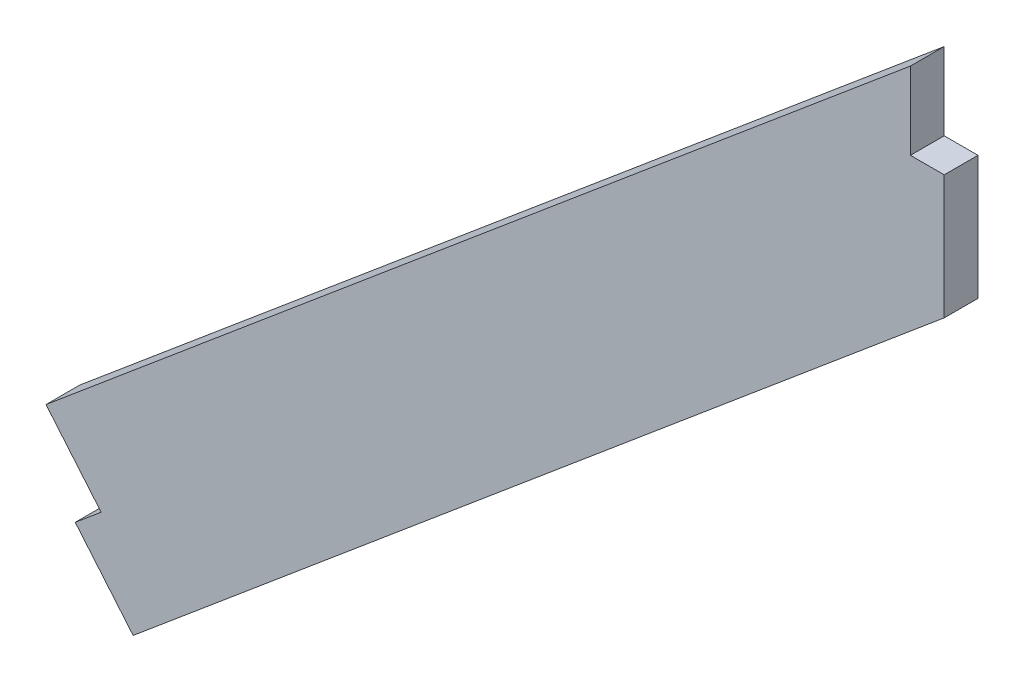
ISO-10303-21;
HEADER;
FILE_DESCRIPTION(('STEP AP214'),'2;1');
FILE_NAME('part.step','',(''),(''),'','','');
FILE_SCHEMA(('AUTOMOTIVE_DESIGN { 1 0 10303 214 1 1 1 1 }'));
ENDSEC;
DATA;
#1=APPLICATION_CONTEXT('core data for automotive mechanical design processes');
#2=APPLICATION_PROTOCOL_DEFINITION('international standard','automotive_design',2000,#1);
#3=PRODUCT_CONTEXT('',#1,'mechanical');
#4=PRODUCT('Part','Part','',(#3));
#5=PRODUCT_RELATED_PRODUCT_CATEGORY('part','',(#4));
#6=PRODUCT_DEFINITION_FORMATION('','',#4);
#7=PRODUCT_DEFINITION_CONTEXT('part definition',#1,'design');
#8=PRODUCT_DEFINITION('design','',#6,#7);
#9=PRODUCT_DEFINITION_SHAPE('','',#8);
#10=(LENGTH_UNIT() NAMED_UNIT(*) SI_UNIT(.MILLI.,.METRE.));
#11=(NAMED_UNIT(*) PLANE_ANGLE_UNIT() SI_UNIT($,.RADIAN.));
#12=(NAMED_UNIT(*) SI_UNIT($,.STERADIAN.) SOLID_ANGLE_UNIT());
#13=UNCERTAINTY_MEASURE_WITH_UNIT(LENGTH_MEASURE(1.E-05),#10,'distance_accuracy_value','');
#14=(GEOMETRIC_REPRESENTATION_CONTEXT(3) GLOBAL_UNCERTAINTY_ASSIGNED_CONTEXT((#13)) GLOBAL_UNIT_ASSIGNED_CONTEXT((#10,
#11,#12)) REPRESENTATION_CONTEXT('',''));
#15=CARTESIAN_POINT('',(0.,0.,0.));
#16=DIRECTION('',(0.,0.,1.));
#17=DIRECTION('',(1.,0.,0.));
#18=AXIS2_PLACEMENT_3D('',#15,#16,#17);
#19=CARTESIAN_POINT('',(0.,-21.34,3.));
#20=DIRECTION('',(-1.,0.,0.));
#21=DIRECTION('',(0.,0.,1.));
#22=AXIS2_PLACEMENT_3D('',#19,#20,#21);
#23=PLANE('',#22);
#24=DIRECTION('',(0.,1.,0.));
#25=VECTOR('',#24,1.);
#26=CARTESIAN_POINT('',(0.,-21.34,0.));
#27=LINE('',#26,#25);
#28=CARTESIAN_POINT('',(0.,-21.34,0.));
#29=VERTEX_POINT('',#28);
#30=CARTESIAN_POINT('',(0.,-10.34,0.));
#31=VERTEX_POINT('',#30);
#32=EDGE_CURVE('E129',#29,#31,#27,.T.);
#33=ORIENTED_EDGE('',*,*,#32,.T.);
#34=DIRECTION('',(0.,0.,-1.));
#35=VECTOR('',#34,1.);
#36=CARTESIAN_POINT('',(0.,-10.34,3.));
#37=LINE('',#36,#35);
#38=CARTESIAN_POINT('',(0.,-10.34,3.));
#39=VERTEX_POINT('',#38);
#40=EDGE_CURVE('E11',#39,#31,#37,.T.);
#41=ORIENTED_EDGE('',*,*,#40,.F.);
#42=DIRECTION('',(0.,1.,0.));
#43=VECTOR('',#42,1.);
#44=CARTESIAN_POINT('',(0.,-21.34,3.));
#45=LINE('',#44,#43);
#46=CARTESIAN_POINT('',(0.,-21.34,3.));
#47=VERTEX_POINT('',#46);
#48=EDGE_CURVE('E143',#47,#39,#45,.T.);
#49=ORIENTED_EDGE('',*,*,#48,.F.);
#50=DIRECTION('',(0.,0.,-1.));
#51=VECTOR('',#50,1.);
#52=CARTESIAN_POINT('',(0.,-21.34,3.));
#53=LINE('',#52,#51);
#54=EDGE_CURVE('E125',#47,#29,#53,.T.);
#55=ORIENTED_EDGE('',*,*,#54,.T.);
#56=EDGE_LOOP('',(#33,#41,#49,#55));
#57=FACE_BOUND('',#56,.T.);
#58=ADVANCED_FACE('F33',(#57),#23,.F.);
#59=CARTESIAN_POINT('',(0.,-10.34,3.));
#60=DIRECTION('',(0.,-1.,0.));
#61=DIRECTION('',(0.,0.,-1.));
#62=AXIS2_PLACEMENT_3D('',#59,#60,#61);
#63=PLANE('',#62);
#64=DIRECTION('',(-1.,0.,0.));
#65=VECTOR('',#64,1.);
#66=CARTESIAN_POINT('',(0.,-10.34,0.));
#67=LINE('',#66,#65);
#68=CARTESIAN_POINT('',(-3.,-10.34,0.));
#69=VERTEX_POINT('',#68);
#70=EDGE_CURVE('E132',#31,#69,#67,.T.);
#71=ORIENTED_EDGE('',*,*,#70,.T.);
#72=DIRECTION('',(0.,0.,-1.));
#73=VECTOR('',#72,1.);
#74=CARTESIAN_POINT('',(-3.,-10.34,3.));
#75=LINE('',#74,#73);
#76=CARTESIAN_POINT('',(-3.,-10.34,3.));
#77=VERTEX_POINT('',#76);
#78=EDGE_CURVE('E41',#77,#69,#75,.T.);
#79=ORIENTED_EDGE('',*,*,#78,.F.);
#80=DIRECTION('',(-1.,0.,0.));
#81=VECTOR('',#80,1.);
#82=CARTESIAN_POINT('',(0.,-10.34,3.));
#83=LINE('',#82,#81);
#84=EDGE_CURVE('E92',#39,#77,#83,.T.);
#85=ORIENTED_EDGE('',*,*,#84,.F.);
#86=ORIENTED_EDGE('',*,*,#40,.T.);
#87=EDGE_LOOP('',(#71,#79,#85,#86));
#88=FACE_BOUND('',#87,.T.);
#89=ADVANCED_FACE('F178',(#88),#63,.F.);
#90=CARTESIAN_POINT('',(-3.,-3.47667354924375,3.));
#91=DIRECTION('',(-1.,0.,0.));
#92=DIRECTION('',(0.,-1.,0.));
#93=AXIS2_PLACEMENT_3D('',#90,#91,#92);
#94=PLANE('',#93);
#95=DIRECTION('',(0.,1.,0.));
#96=VECTOR('',#95,1.);
#97=CARTESIAN_POINT('',(-3.,-3.47667354924375,0.));
#98=LINE('',#97,#96);
#99=CARTESIAN_POINT('',(-3.,-3.47667354924375,0.));
#100=VERTEX_POINT('',#99);
#101=EDGE_CURVE('E134',#69,#100,#98,.T.);
#102=ORIENTED_EDGE('',*,*,#101,.T.);
#103=DIRECTION('',(0.,0.,-1.));
#104=VECTOR('',#103,1.);
#105=CARTESIAN_POINT('',(-3.,-3.47667354924375,3.));
#106=LINE('',#105,#104);
#107=CARTESIAN_POINT('',(-3.,-3.47667354924375,3.));
#108=VERTEX_POINT('',#107);
#109=EDGE_CURVE('E150',#108,#100,#106,.T.);
#110=ORIENTED_EDGE('',*,*,#109,.F.);
#111=DIRECTION('',(0.,1.,0.));
#112=VECTOR('',#111,1.);
#113=CARTESIAN_POINT('',(-3.,-3.47667354924375,3.));
#114=LINE('',#113,#112);
#115=EDGE_CURVE('E158',#77,#108,#114,.T.);
#116=ORIENTED_EDGE('',*,*,#115,.F.);
#117=ORIENTED_EDGE('',*,*,#78,.T.);
#118=EDGE_LOOP('',(#102,#110,#116,#117));
#119=FACE_BOUND('',#118,.T.);
#120=ADVANCED_FACE('F156',(#119),#94,.F.);
#121=CARTESIAN_POINT('',(-79.7455432489733,-67.8738305839565,3.));
#122=DIRECTION('',(0.642787609686535,-0.766044443118981,0.));
#123=DIRECTION('',(0.766044443118982,0.642787609686535,0.));
#124=AXIS2_PLACEMENT_3D('',#121,#122,#123);
#125=PLANE('',#124);
#126=DIRECTION('',(-0.766044443118982,-0.642787609686535,0.));
#127=VECTOR('',#126,1.);
#128=CARTESIAN_POINT('',(-79.7455432489733,-67.8738305839565,0.));
#129=LINE('',#128,#127);
#130=CARTESIAN_POINT('',(-79.7455432489733,-67.8738305839565,0.));
#131=VERTEX_POINT('',#130);
#132=EDGE_CURVE('E136',#100,#131,#129,.T.);
#133=ORIENTED_EDGE('',*,*,#132,.T.);
#134=DIRECTION('',(0.,0.,-1.));
#135=VECTOR('',#134,1.);
#136=CARTESIAN_POINT('',(-79.7455432489733,-67.8738305839565,3.));
#137=LINE('',#136,#135);
#138=CARTESIAN_POINT('',(-79.7455432489733,-67.8738305839565,3.));
#139=VERTEX_POINT('',#138);
#140=EDGE_CURVE('E147',#139,#131,#137,.T.);
#141=ORIENTED_EDGE('',*,*,#140,.F.);
#142=DIRECTION('',(-0.766044443118982,-0.642787609686535,0.));
#143=VECTOR('',#142,1.);
#144=CARTESIAN_POINT('',(-79.7455432489733,-67.8738305839565,3.));
#145=LINE('',#144,#143);
#146=EDGE_CURVE('E170',#108,#139,#145,.T.);
#147=ORIENTED_EDGE('',*,*,#146,.F.);
#148=ORIENTED_EDGE('',*,*,#109,.T.);
#149=EDGE_LOOP('',(#133,#141,#147,#148));
#150=FACE_BOUND('',#149,.T.);
#151=ADVANCED_FACE('F166',(#150),#125,.F.);
#152=CARTESIAN_POINT('',(-74.8523452013196,-73.7053169365228,3.));
#153=DIRECTION('',(0.766044443118983,0.642787609686533,0.));
#154=DIRECTION('',(-0.642787609686533,0.766044443118983,0.));
#155=AXIS2_PLACEMENT_3D('',#152,#153,#154);
#156=PLANE('',#155);
#157=DIRECTION('',(0.642787609686533,-0.766044443118983,0.));
#158=VECTOR('',#157,1.);
#159=CARTESIAN_POINT('',(-74.8523452013196,-73.7053169365228,0.));
#160=LINE('',#159,#158);
#161=CARTESIAN_POINT('',(-74.8523452013196,-73.7053169365228,0.));
#162=VERTEX_POINT('',#161);
#163=EDGE_CURVE('E138',#131,#162,#160,.T.);
#164=ORIENTED_EDGE('',*,*,#163,.T.);
#165=DIRECTION('',(0.,0.,-1.));
#166=VECTOR('',#165,1.);
#167=CARTESIAN_POINT('',(-74.8523452013196,-73.7053169365228,3.));
#168=LINE('',#167,#166);
#169=CARTESIAN_POINT('',(-74.8523452013196,-73.7053169365228,3.));
#170=VERTEX_POINT('',#169);
#171=EDGE_CURVE('E120',#170,#162,#168,.T.);
#172=ORIENTED_EDGE('',*,*,#171,.F.);
#173=DIRECTION('',(0.642787609686533,-0.766044443118983,0.));
#174=VECTOR('',#173,1.);
#175=CARTESIAN_POINT('',(-74.8523452013196,-73.7053169365228,3.));
#176=LINE('',#175,#174);
#177=EDGE_CURVE('E111',#139,#170,#176,.T.);
#178=ORIENTED_EDGE('',*,*,#177,.F.);
#179=ORIENTED_EDGE('',*,*,#140,.T.);
#180=EDGE_LOOP('',(#164,#172,#178,#179));
#181=FACE_BOUND('',#180,.T.);
#182=ADVANCED_FACE('F169',(#181),#156,.F.);
#183=CARTESIAN_POINT('',(-77.1504785306765,-75.6336797655824,3.));
#184=DIRECTION('',(0.64278760968653,-0.766044443118985,0.));
#185=DIRECTION('',(0.766044443118985,0.64278760968653,0.));
#186=AXIS2_PLACEMENT_3D('',#183,#184,#185);
#187=PLANE('',#186);
#188=DIRECTION('',(-0.766044443118985,-0.64278760968653,0.));
#189=VECTOR('',#188,1.);
#190=CARTESIAN_POINT('',(-77.1504785306765,-75.6336797655824,0.));
#191=LINE('',#190,#189);
#192=CARTESIAN_POINT('',(-77.1504785306765,-75.6336797655824,0.));
#193=VERTEX_POINT('',#192);
#194=EDGE_CURVE('E119',#162,#193,#191,.T.);
#195=ORIENTED_EDGE('',*,*,#194,.T.);
#196=DIRECTION('',(0.,0.,-1.));
#197=VECTOR('',#196,1.);
#198=CARTESIAN_POINT('',(-77.1504785306765,-75.6336797655824,3.));
#199=LINE('',#198,#197);
#200=CARTESIAN_POINT('',(-77.1504785306765,-75.6336797655824,3.));
#201=VERTEX_POINT('',#200);
#202=EDGE_CURVE('E116',#201,#193,#199,.T.);
#203=ORIENTED_EDGE('',*,*,#202,.F.);
#204=DIRECTION('',(-0.766044443118985,-0.64278760968653,0.));
#205=VECTOR('',#204,1.);
#206=CARTESIAN_POINT('',(-77.1504785306765,-75.6336797655824,3.));
#207=LINE('',#206,#205);
#208=EDGE_CURVE('E105',#170,#201,#207,.T.);
#209=ORIENTED_EDGE('',*,*,#208,.F.);
#210=ORIENTED_EDGE('',*,*,#171,.T.);
#211=EDGE_LOOP('',(#195,#203,#209,#210));
#212=FACE_BOUND('',#211,.T.);
#213=ADVANCED_FACE('F117',(#212),#187,.F.);
#214=CARTESIAN_POINT('',(-72.0081776531843,-81.7620353105343,3.));
#215=DIRECTION('',(0.766044443118983,0.642787609686533,0.));
#216=DIRECTION('',(-0.642787609686533,0.766044443118983,0.));
#217=AXIS2_PLACEMENT_3D('',#214,#215,#216);
#218=PLANE('',#217);
#219=DIRECTION('',(0.642787609686533,-0.766044443118983,0.));
#220=VECTOR('',#219,1.);
#221=CARTESIAN_POINT('',(-72.0081776531843,-81.7620353105343,0.));
#222=LINE('',#221,#220);
#223=CARTESIAN_POINT('',(-72.0081776531843,-81.7620353105343,0.));
#224=VERTEX_POINT('',#223);
#225=EDGE_CURVE('E78',#193,#224,#222,.T.);
#226=ORIENTED_EDGE('',*,*,#225,.T.);
#227=DIRECTION('',(0.,0.,-1.));
#228=VECTOR('',#227,1.);
#229=CARTESIAN_POINT('',(-72.0081776531843,-81.7620353105343,3.));
#230=LINE('',#229,#228);
#231=CARTESIAN_POINT('',(-72.0081776531843,-81.7620353105343,3.));
#232=VERTEX_POINT('',#231);
#233=EDGE_CURVE('E121',#232,#224,#230,.T.);
#234=ORIENTED_EDGE('',*,*,#233,.F.);
#235=DIRECTION('',(0.642787609686533,-0.766044443118983,0.));
#236=VECTOR('',#235,1.);
#237=CARTESIAN_POINT('',(-72.0081776531843,-81.7620353105343,3.));
#238=LINE('',#237,#236);
#239=EDGE_CURVE('E109',#201,#232,#238,.T.);
#240=ORIENTED_EDGE('',*,*,#239,.F.);
#241=ORIENTED_EDGE('',*,*,#202,.T.);
#242=EDGE_LOOP('',(#226,#234,#240,#241));
#243=FACE_BOUND('',#242,.T.);
#244=ADVANCED_FACE('F123',(#243),#218,.F.);
#245=CARTESIAN_POINT('',(0.,-21.34,3.));
#246=DIRECTION('',(-0.642787609686535,0.766044443118982,0.));
#247=DIRECTION('',(-0.766044443118982,-0.642787609686535,0.));
#248=AXIS2_PLACEMENT_3D('',#245,#246,#247);
#249=PLANE('',#248);
#250=DIRECTION('',(0.766044443118982,0.642787609686535,0.));
#251=VECTOR('',#250,1.);
#252=CARTESIAN_POINT('',(0.,-21.34,0.));
#253=LINE('',#252,#251);
#254=EDGE_CURVE('E84',#224,#29,#253,.T.);
#255=ORIENTED_EDGE('',*,*,#254,.T.);
#256=ORIENTED_EDGE('',*,*,#54,.F.);
#257=DIRECTION('',(0.766044443118982,0.642787609686535,0.));
#258=VECTOR('',#257,1.);
#259=CARTESIAN_POINT('',(0.,-21.34,3.));
#260=LINE('',#259,#258);
#261=EDGE_CURVE('E49',#232,#47,#260,.T.);
#262=ORIENTED_EDGE('',*,*,#261,.F.);
#263=ORIENTED_EDGE('',*,*,#233,.T.);
#264=EDGE_LOOP('',(#255,#256,#262,#263));
#265=FACE_BOUND('',#264,.T.);
#266=ADVANCED_FACE('F194',(#265),#249,.F.);
#267=CARTESIAN_POINT('',(0.,0.,3.));
#268=DIRECTION('',(0.,0.,1.));
#269=DIRECTION('',(1.,0.,0.));
#270=AXIS2_PLACEMENT_3D('',#267,#268,#269);
#271=PLANE('',#270);
#272=ORIENTED_EDGE('',*,*,#48,.T.);
#273=ORIENTED_EDGE('',*,*,#84,.T.);
#274=ORIENTED_EDGE('',*,*,#115,.T.);
#275=ORIENTED_EDGE('',*,*,#146,.T.);
#276=ORIENTED_EDGE('',*,*,#177,.T.);
#277=ORIENTED_EDGE('',*,*,#208,.T.);
#278=ORIENTED_EDGE('',*,*,#239,.T.);
#279=ORIENTED_EDGE('',*,*,#261,.T.);
#280=EDGE_LOOP('',(#272,#273,#274,#275,#276,#277,#278,#279));
#281=FACE_BOUND('',#280,.T.);
#282=ADVANCED_FACE('F107',(#281),#271,.T.);
#283=CARTESIAN_POINT('',(0.,0.,0.));
#284=DIRECTION('',(0.,0.,1.));
#285=DIRECTION('',(1.,0.,0.));
#286=AXIS2_PLACEMENT_3D('',#283,#284,#285);
#287=PLANE('',#286);
#288=ORIENTED_EDGE('',*,*,#32,.F.);
#289=ORIENTED_EDGE('',*,*,#254,.F.);
#290=ORIENTED_EDGE('',*,*,#225,.F.);
#291=ORIENTED_EDGE('',*,*,#194,.F.);
#292=ORIENTED_EDGE('',*,*,#163,.F.);
#293=ORIENTED_EDGE('',*,*,#132,.F.);
#294=ORIENTED_EDGE('',*,*,#101,.F.);
#295=ORIENTED_EDGE('',*,*,#70,.F.);
#296=EDGE_LOOP('',(#288,#289,#290,#291,#292,#293,#294,#295));
#297=FACE_BOUND('',#296,.T.);
#298=ADVANCED_FACE('F162',(#297),#287,.F.);
#299=CLOSED_SHELL('',(#58,#89,#120,#151,#182,#213,#244,#266,#282,#298));
#300=MANIFOLD_SOLID_BREP('B2',#299);
#301=ADVANCED_BREP_SHAPE_REPRESENTATION('',(#18,#300),#14);
#302=SHAPE_DEFINITION_REPRESENTATION(#9,#301);
ENDSEC;
END-ISO-10303-21;
